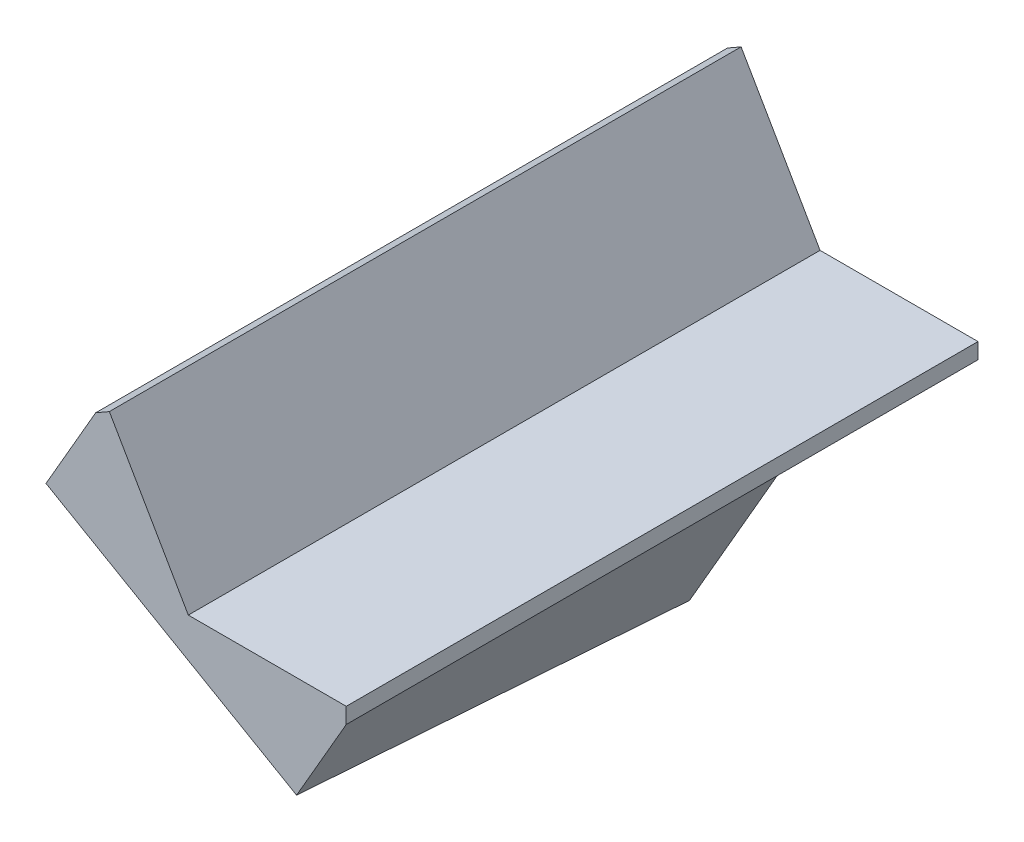
ISO-10303-21;
HEADER;
FILE_DESCRIPTION(('STEP AP214'),'2;1');
FILE_NAME('part.step','',(''),(''),'','','');
FILE_SCHEMA(('AUTOMOTIVE_DESIGN { 1 0 10303 214 1 1 1 1 }'));
ENDSEC;
DATA;
#1=APPLICATION_CONTEXT('core data for automotive mechanical design processes');
#2=APPLICATION_PROTOCOL_DEFINITION('international standard','automotive_design',2000,#1);
#3=PRODUCT_CONTEXT('',#1,'mechanical');
#4=PRODUCT('Part','Part','',(#3));
#5=PRODUCT_RELATED_PRODUCT_CATEGORY('part','',(#4));
#6=PRODUCT_DEFINITION_FORMATION('','',#4);
#7=PRODUCT_DEFINITION_CONTEXT('part definition',#1,'design');
#8=PRODUCT_DEFINITION('design','',#6,#7);
#9=PRODUCT_DEFINITION_SHAPE('','',#8);
#10=(LENGTH_UNIT() NAMED_UNIT(*) SI_UNIT(.MILLI.,.METRE.));
#11=(NAMED_UNIT(*) PLANE_ANGLE_UNIT() SI_UNIT($,.RADIAN.));
#12=(NAMED_UNIT(*) SI_UNIT($,.STERADIAN.) SOLID_ANGLE_UNIT());
#13=UNCERTAINTY_MEASURE_WITH_UNIT(LENGTH_MEASURE(1.E-05),#10,'distance_accuracy_value','');
#14=(GEOMETRIC_REPRESENTATION_CONTEXT(3) GLOBAL_UNCERTAINTY_ASSIGNED_CONTEXT((#13)) GLOBAL_UNIT_ASSIGNED_CONTEXT((#10,
#11,#12)) REPRESENTATION_CONTEXT('',''));
#15=CARTESIAN_POINT('',(0.,0.,0.));
#16=DIRECTION('',(0.,0.,1.));
#17=DIRECTION('',(1.,0.,0.));
#18=AXIS2_PLACEMENT_3D('',#15,#16,#17);
#19=CARTESIAN_POINT('',(0.,0.,80.));
#20=DIRECTION('',(0.,1.,0.));
#21=DIRECTION('',(-1.,0.,0.));
#22=AXIS2_PLACEMENT_3D('',#19,#20,#21);
#23=PLANE('',#22);
#24=DIRECTION('',(0.,0.,-1.));
#25=VECTOR('',#24,1.);
#26=CARTESIAN_POINT('',(21.1547005383792,0.,80.));
#27=LINE('',#26,#25);
#28=CARTESIAN_POINT('',(21.1547005383792,0.,25.4327736085515));
#29=VERTEX_POINT('',#28);
#30=CARTESIAN_POINT('',(21.1547005383792,0.,0.));
#31=VERTEX_POINT('',#30);
#32=EDGE_CURVE('E129',#29,#31,#27,.T.);
#33=ORIENTED_EDGE('',*,*,#32,.F.);
#34=DIRECTION('',(1.,0.,0.));
#35=VECTOR('',#34,1.);
#36=CARTESIAN_POINT('',(0.,0.,25.4327736085515));
#37=LINE('',#36,#35);
#38=CARTESIAN_POINT('',(0.,0.,25.4327736085515));
#39=VERTEX_POINT('',#38);
#40=EDGE_CURVE('E63',#39,#29,#37,.T.);
#41=ORIENTED_EDGE('',*,*,#40,.F.);
#42=DIRECTION('',(0.,0.,-1.));
#43=VECTOR('',#42,1.);
#44=CARTESIAN_POINT('',(0.,0.,80.));
#45=LINE('',#44,#43);
#46=CARTESIAN_POINT('',(0.,0.,0.));
#47=VERTEX_POINT('',#46);
#48=EDGE_CURVE('E149',#39,#47,#45,.T.);
#49=ORIENTED_EDGE('',*,*,#48,.T.);
#50=DIRECTION('',(1.,0.,0.));
#51=VECTOR('',#50,1.);
#52=CARTESIAN_POINT('',(0.,0.,0.));
#53=LINE('',#52,#51);
#54=EDGE_CURVE('E150',#47,#31,#53,.T.);
#55=ORIENTED_EDGE('',*,*,#54,.T.);
#56=EDGE_LOOP('',(#33,#41,#49,#55));
#57=FACE_BOUND('',#56,.T.);
#58=ADVANCED_FACE('F43',(#57),#23,.F.);
#59=CARTESIAN_POINT('',(0.,0.,80.));
#60=DIRECTION('',(0.866025403784436,0.500000000000005,0.));
#61=DIRECTION('',(-0.500000000000005,0.866025403784436,0.));
#62=AXIS2_PLACEMENT_3D('',#59,#60,#61);
#63=PLANE('',#62);
#64=DIRECTION('',(0.500000000000005,-0.866025403784436,0.));
#65=VECTOR('',#64,1.);
#66=CARTESIAN_POINT('',(0.,0.,25.4327736085515));
#67=LINE('',#66,#65);
#68=CARTESIAN_POINT('',(-10.5773502691897,18.3205080756887,25.4327736085515));
#69=VERTEX_POINT('',#68);
#70=EDGE_CURVE('E11',#69,#39,#67,.T.);
#71=ORIENTED_EDGE('',*,*,#70,.F.);
#72=DIRECTION('',(0.,0.,-1.));
#73=VECTOR('',#72,1.);
#74=CARTESIAN_POINT('',(-10.5773502691897,18.3205080756887,80.));
#75=LINE('',#74,#73);
#76=CARTESIAN_POINT('',(-10.5773502691897,18.3205080756887,0.));
#77=VERTEX_POINT('',#76);
#78=EDGE_CURVE('E162',#69,#77,#75,.T.);
#79=ORIENTED_EDGE('',*,*,#78,.T.);
#80=DIRECTION('',(0.500000000000005,-0.866025403784436,0.));
#81=VECTOR('',#80,1.);
#82=CARTESIAN_POINT('',(0.,0.,0.));
#83=LINE('',#82,#81);
#84=EDGE_CURVE('E135',#77,#47,#83,.T.);
#85=ORIENTED_EDGE('',*,*,#84,.T.);
#86=ORIENTED_EDGE('',*,*,#48,.F.);
#87=EDGE_LOOP('',(#71,#79,#85,#86));
#88=FACE_BOUND('',#87,.T.);
#89=ADVANCED_FACE('F180',(#88),#63,.F.);
#90=CARTESIAN_POINT('',(21.1547005383792,0.,80.));
#91=DIRECTION('',(-1.,0.,0.));
#92=DIRECTION('',(0.,0.,1.));
#93=AXIS2_PLACEMENT_3D('',#90,#91,#92);
#94=PLANE('',#93);
#95=DIRECTION('',(0.,1.,0.));
#96=VECTOR('',#95,1.);
#97=CARTESIAN_POINT('',(21.1547005383792,0.,0.));
#98=LINE('',#97,#96);
#99=CARTESIAN_POINT('',(21.1547005383792,2.,0.));
#100=VERTEX_POINT('',#99);
#101=EDGE_CURVE('E153',#31,#100,#98,.T.);
#102=ORIENTED_EDGE('',*,*,#101,.T.);
#103=DIRECTION('',(0.,0.,-1.));
#104=VECTOR('',#103,1.);
#105=CARTESIAN_POINT('',(21.1547005383792,2.,80.));
#106=LINE('',#105,#104);
#107=CARTESIAN_POINT('',(21.1547005383792,2.,80.));
#108=VERTEX_POINT('',#107);
#109=EDGE_CURVE('E132',#108,#100,#106,.T.);
#110=ORIENTED_EDGE('',*,*,#109,.F.);
#111=DIRECTION('',(0.,1.,0.));
#112=VECTOR('',#111,1.);
#113=CARTESIAN_POINT('',(21.1547005383792,0.,80.));
#114=LINE('',#113,#112);
#115=CARTESIAN_POINT('',(21.1547005383792,0.,80.));
#116=VERTEX_POINT('',#115);
#117=EDGE_CURVE('E114',#116,#108,#114,.T.);
#118=ORIENTED_EDGE('',*,*,#117,.F.);
#119=EDGE_CURVE('E50',#116,#29,#27,.T.);
#120=ORIENTED_EDGE('',*,*,#119,.T.);
#121=ORIENTED_EDGE('',*,*,#32,.T.);
#122=EDGE_LOOP('',(#102,#110,#118,#120,#121));
#123=FACE_BOUND('',#122,.T.);
#124=ADVANCED_FACE('F130',(#123),#94,.F.);
#125=CARTESIAN_POINT('',(21.1547005383792,2.,80.));
#126=DIRECTION('',(0.,-1.,0.));
#127=DIRECTION('',(1.,0.,0.));
#128=AXIS2_PLACEMENT_3D('',#125,#126,#127);
#129=PLANE('',#128);
#130=DIRECTION('',(-1.,0.,0.));
#131=VECTOR('',#130,1.);
#132=CARTESIAN_POINT('',(21.1547005383792,2.,0.));
#133=LINE('',#132,#131);
#134=CARTESIAN_POINT('',(1.15470053837924,2.,0.));
#135=VERTEX_POINT('',#134);
#136=EDGE_CURVE('E155',#100,#135,#133,.T.);
#137=ORIENTED_EDGE('',*,*,#136,.T.);
#138=DIRECTION('',(0.,0.,-1.));
#139=VECTOR('',#138,1.);
#140=CARTESIAN_POINT('',(1.15470053837924,2.,80.));
#141=LINE('',#140,#139);
#142=CARTESIAN_POINT('',(1.15470053837924,2.,80.));
#143=VERTEX_POINT('',#142);
#144=EDGE_CURVE('E169',#143,#135,#141,.T.);
#145=ORIENTED_EDGE('',*,*,#144,.F.);
#146=DIRECTION('',(-1.,0.,0.));
#147=VECTOR('',#146,1.);
#148=CARTESIAN_POINT('',(21.1547005383792,2.,80.));
#149=LINE('',#148,#147);
#150=EDGE_CURVE('E134',#108,#143,#149,.T.);
#151=ORIENTED_EDGE('',*,*,#150,.F.);
#152=ORIENTED_EDGE('',*,*,#109,.T.);
#153=EDGE_LOOP('',(#137,#145,#151,#152));
#154=FACE_BOUND('',#153,.T.);
#155=ADVANCED_FACE('F192',(#154),#129,.F.);
#156=CARTESIAN_POINT('',(-8.84529946162085,19.3205080756887,80.));
#157=DIRECTION('',(-0.866025403784436,-0.500000000000004,0.));
#158=DIRECTION('',(0.500000000000004,-0.866025403784436,0.));
#159=AXIS2_PLACEMENT_3D('',#156,#157,#158);
#160=PLANE('',#159);
#161=DIRECTION('',(-0.500000000000004,0.866025403784436,0.));
#162=VECTOR('',#161,1.);
#163=CARTESIAN_POINT('',(-8.84529946162085,19.3205080756887,0.));
#164=LINE('',#163,#162);
#165=CARTESIAN_POINT('',(-8.84529946162085,19.3205080756887,0.));
#166=VERTEX_POINT('',#165);
#167=EDGE_CURVE('E157',#135,#166,#164,.T.);
#168=ORIENTED_EDGE('',*,*,#167,.T.);
#169=DIRECTION('',(0.,0.,-1.));
#170=VECTOR('',#169,1.);
#171=CARTESIAN_POINT('',(-8.84529946162085,19.3205080756887,80.));
#172=LINE('',#171,#170);
#173=CARTESIAN_POINT('',(-8.84529946162085,19.3205080756887,80.));
#174=VERTEX_POINT('',#173);
#175=EDGE_CURVE('E166',#174,#166,#172,.T.);
#176=ORIENTED_EDGE('',*,*,#175,.F.);
#177=DIRECTION('',(-0.500000000000004,0.866025403784436,0.));
#178=VECTOR('',#177,1.);
#179=CARTESIAN_POINT('',(-8.84529946162085,19.3205080756887,80.));
#180=LINE('',#179,#178);
#181=EDGE_CURVE('E137',#143,#174,#180,.T.);
#182=ORIENTED_EDGE('',*,*,#181,.F.);
#183=ORIENTED_EDGE('',*,*,#144,.T.);
#184=EDGE_LOOP('',(#168,#176,#182,#183));
#185=FACE_BOUND('',#184,.T.);
#186=ADVANCED_FACE('F190',(#185),#160,.F.);
#187=CARTESIAN_POINT('',(-10.5773502691897,18.3205080756887,80.));
#188=DIRECTION('',(0.500000000000002,-0.866025403784437,0.));
#189=DIRECTION('',(0.866025403784437,0.500000000000002,0.));
#190=AXIS2_PLACEMENT_3D('',#187,#188,#189);
#191=PLANE('',#190);
#192=DIRECTION('',(-0.866025403784437,-0.500000000000003,0.));
#193=VECTOR('',#192,1.);
#194=CARTESIAN_POINT('',(-10.5773502691897,18.3205080756887,0.));
#195=LINE('',#194,#193);
#196=EDGE_CURVE('E140',#166,#77,#195,.T.);
#197=ORIENTED_EDGE('',*,*,#196,.T.);
#198=ORIENTED_EDGE('',*,*,#78,.F.);
#199=CARTESIAN_POINT('',(-10.5773502691897,18.3205080756887,80.));
#200=VERTEX_POINT('',#199);
#201=EDGE_CURVE('E163',#200,#69,#75,.T.);
#202=ORIENTED_EDGE('',*,*,#201,.F.);
#203=DIRECTION('',(-0.866025403784437,-0.500000000000003,0.));
#204=VECTOR('',#203,1.);
#205=CARTESIAN_POINT('',(-10.5773502691897,18.3205080756887,80.));
#206=LINE('',#205,#204);
#207=EDGE_CURVE('E146',#174,#200,#206,.T.);
#208=ORIENTED_EDGE('',*,*,#207,.F.);
#209=ORIENTED_EDGE('',*,*,#175,.T.);
#210=EDGE_LOOP('',(#197,#198,#202,#208,#209));
#211=FACE_BOUND('',#210,.T.);
#212=ADVANCED_FACE('F184',(#211),#191,.F.);
#213=CARTESIAN_POINT('',(0.,0.,80.));
#214=DIRECTION('',(0.,0.,1.));
#215=DIRECTION('',(1.,0.,0.));
#216=AXIS2_PLACEMENT_3D('',#213,#214,#215);
#217=PLANE('',#216);
#218=DIRECTION('',(-0.499999999999998,-0.86602540378444,0.));
#219=VECTOR('',#218,1.);
#220=CARTESIAN_POINT('',(15.8660254037845,-9.16025403784435,80.));
#221=LINE('',#220,#219);
#222=CARTESIAN_POINT('',(14.8660254037845,-10.8923048454132,80.));
#223=VERTEX_POINT('',#222);
#224=EDGE_CURVE('E110',#116,#223,#221,.T.);
#225=ORIENTED_EDGE('',*,*,#224,.F.);
#226=ORIENTED_EDGE('',*,*,#117,.T.);
#227=ORIENTED_EDGE('',*,*,#150,.T.);
#228=ORIENTED_EDGE('',*,*,#181,.T.);
#229=ORIENTED_EDGE('',*,*,#207,.T.);
#230=DIRECTION('',(-0.499999999999998,-0.86602540378444,0.));
#231=VECTOR('',#230,1.);
#232=CARTESIAN_POINT('',(-15.8660254037845,9.16025403784436,80.));
#233=LINE('',#232,#231);
#234=CARTESIAN_POINT('',(-16.8660254037845,7.42820323027548,80.));
#235=VERTEX_POINT('',#234);
#236=EDGE_CURVE('E193',#200,#235,#233,.T.);
#237=ORIENTED_EDGE('',*,*,#236,.T.);
#238=DIRECTION('',(-0.86602540378444,0.499999999999998,0.));
#239=VECTOR('',#238,1.);
#240=CARTESIAN_POINT('',(14.8660254037845,-10.8923048454132,80.));
#241=LINE('',#240,#239);
#242=EDGE_CURVE('E117',#223,#235,#241,.T.);
#243=ORIENTED_EDGE('',*,*,#242,.F.);
#244=EDGE_LOOP('',(#225,#226,#227,#228,#229,#237,#243));
#245=FACE_BOUND('',#244,.T.);
#246=ADVANCED_FACE('F112',(#245),#217,.T.);
#247=CARTESIAN_POINT('',(0.,0.,0.));
#248=DIRECTION('',(0.,0.,1.));
#249=DIRECTION('',(1.,0.,0.));
#250=AXIS2_PLACEMENT_3D('',#247,#248,#249);
#251=PLANE('',#250);
#252=ORIENTED_EDGE('',*,*,#54,.F.);
#253=ORIENTED_EDGE('',*,*,#84,.F.);
#254=ORIENTED_EDGE('',*,*,#196,.F.);
#255=ORIENTED_EDGE('',*,*,#167,.F.);
#256=ORIENTED_EDGE('',*,*,#136,.F.);
#257=ORIENTED_EDGE('',*,*,#101,.F.);
#258=EDGE_LOOP('',(#252,#253,#254,#255,#256,#257));
#259=FACE_BOUND('',#258,.T.);
#260=ADVANCED_FACE('F177',(#259),#251,.F.);
#261=CARTESIAN_POINT('',(16.3660254037845,-8.29422863405991,25.4327736085515));
#262=DIRECTION('',(0.,0.,1.));
#263=DIRECTION('',(0.,-1.,0.));
#264=AXIS2_PLACEMENT_3D('',#261,#262,#263);
#265=PLANE('',#264);
#266=ORIENTED_EDGE('',*,*,#70,.T.);
#267=ORIENTED_EDGE('',*,*,#40,.T.);
#268=DIRECTION('',(0.499999999999998,0.86602540378444,0.));
#269=VECTOR('',#268,1.);
#270=CARTESIAN_POINT('',(11.0551882661648,-17.4928683871409,25.4327736085515));
#271=LINE('',#270,#269);
#272=CARTESIAN_POINT('',(10.0551882661648,-19.2249191947098,25.4327736085515));
#273=VERTEX_POINT('',#272);
#274=EDGE_CURVE('E127',#273,#29,#271,.T.);
#275=ORIENTED_EDGE('',*,*,#274,.F.);
#276=DIRECTION('',(-0.86602540378444,0.499999999999998,0.));
#277=VECTOR('',#276,1.);
#278=CARTESIAN_POINT('',(10.0551882661648,-19.2249191947098,25.4327736085515));
#279=LINE('',#278,#277);
#280=CARTESIAN_POINT('',(-21.6768625414042,-0.904411119021104,25.4327736085515));
#281=VERTEX_POINT('',#280);
#282=EDGE_CURVE('E206',#273,#281,#279,.T.);
#283=ORIENTED_EDGE('',*,*,#282,.T.);
#284=DIRECTION('',(0.499999999999998,0.86602540378444,0.));
#285=VECTOR('',#284,1.);
#286=CARTESIAN_POINT('',(-20.6768625414042,0.827639688547778,25.4327736085515));
#287=LINE('',#286,#285);
#288=EDGE_CURVE('E121',#281,#69,#287,.T.);
#289=ORIENTED_EDGE('',*,*,#288,.T.);
#290=EDGE_LOOP('',(#266,#267,#275,#283,#289));
#291=FACE_BOUND('',#290,.T.);
#292=ADVANCED_FACE('F209',(#291),#265,.F.);
#293=CARTESIAN_POINT('',(10.0551882661648,-19.2249191947098,25.4327736085515));
#294=DIRECTION('',(0.492403876506102,0.852868531952444,-0.173648177666931));
#295=DIRECTION('',(-0.86602540378444,0.499999999999998,0.));
#296=AXIS2_PLACEMENT_3D('',#293,#294,#295);
#297=PLANE('',#296);
#298=ORIENTED_EDGE('',*,*,#242,.T.);
#299=DIRECTION('',(-0.0868240888334652,-0.150383733180436,-0.984807753012208));
#300=VECTOR('',#299,1.);
#301=CARTESIAN_POINT('',(-21.6768625414042,-0.904411119021104,25.4327736085515));
#302=LINE('',#301,#300);
#303=EDGE_CURVE('E199',#235,#281,#302,.T.);
#304=ORIENTED_EDGE('',*,*,#303,.T.);
#305=ORIENTED_EDGE('',*,*,#282,.F.);
#306=DIRECTION('',(-0.0868240888334652,-0.150383733180436,-0.984807753012208));
#307=VECTOR('',#306,1.);
#308=CARTESIAN_POINT('',(10.0551882661648,-19.2249191947098,25.4327736085515));
#309=LINE('',#308,#307);
#310=EDGE_CURVE('E120',#223,#273,#309,.T.);
#311=ORIENTED_EDGE('',*,*,#310,.F.);
#312=EDGE_LOOP('',(#298,#304,#305,#311));
#313=FACE_BOUND('',#312,.T.);
#314=ADVANCED_FACE('F211',(#313),#297,.F.);
#315=CARTESIAN_POINT('',(15.8660254037845,-9.16025403784435,0.));
#316=DIRECTION('',(-0.86602540378444,0.499999999999998,0.));
#317=DIRECTION('',(-0.499999999999998,-0.86602540378444,0.));
#318=AXIS2_PLACEMENT_3D('',#315,#316,#317);
#319=PLANE('',#318);
#320=ORIENTED_EDGE('',*,*,#224,.T.);
#321=ORIENTED_EDGE('',*,*,#310,.T.);
#322=ORIENTED_EDGE('',*,*,#274,.T.);
#323=ORIENTED_EDGE('',*,*,#119,.F.);
#324=EDGE_LOOP('',(#320,#321,#322,#323));
#325=FACE_BOUND('',#324,.T.);
#326=ADVANCED_FACE('F125',(#325),#319,.F.);
#327=CARTESIAN_POINT('',(-15.8660254037845,9.16025403784436,0.));
#328=DIRECTION('',(-0.86602540378444,0.499999999999998,0.));
#329=DIRECTION('',(-0.499999999999998,-0.86602540378444,0.));
#330=AXIS2_PLACEMENT_3D('',#327,#328,#329);
#331=PLANE('',#330);
#332=ORIENTED_EDGE('',*,*,#236,.F.);
#333=ORIENTED_EDGE('',*,*,#201,.T.);
#334=ORIENTED_EDGE('',*,*,#288,.F.);
#335=ORIENTED_EDGE('',*,*,#303,.F.);
#336=EDGE_LOOP('',(#332,#333,#334,#335));
#337=FACE_BOUND('',#336,.T.);
#338=ADVANCED_FACE('F197',(#337),#331,.T.);
#339=CLOSED_SHELL('',(#58,#89,#124,#155,#186,#212,#246,#260,#292,#314,#326,#338));
#340=MANIFOLD_SOLID_BREP('B2',#339);
#341=ADVANCED_BREP_SHAPE_REPRESENTATION('',(#18,#340),#14);
#342=SHAPE_DEFINITION_REPRESENTATION(#9,#341);
ENDSEC;
END-ISO-10303-21;
